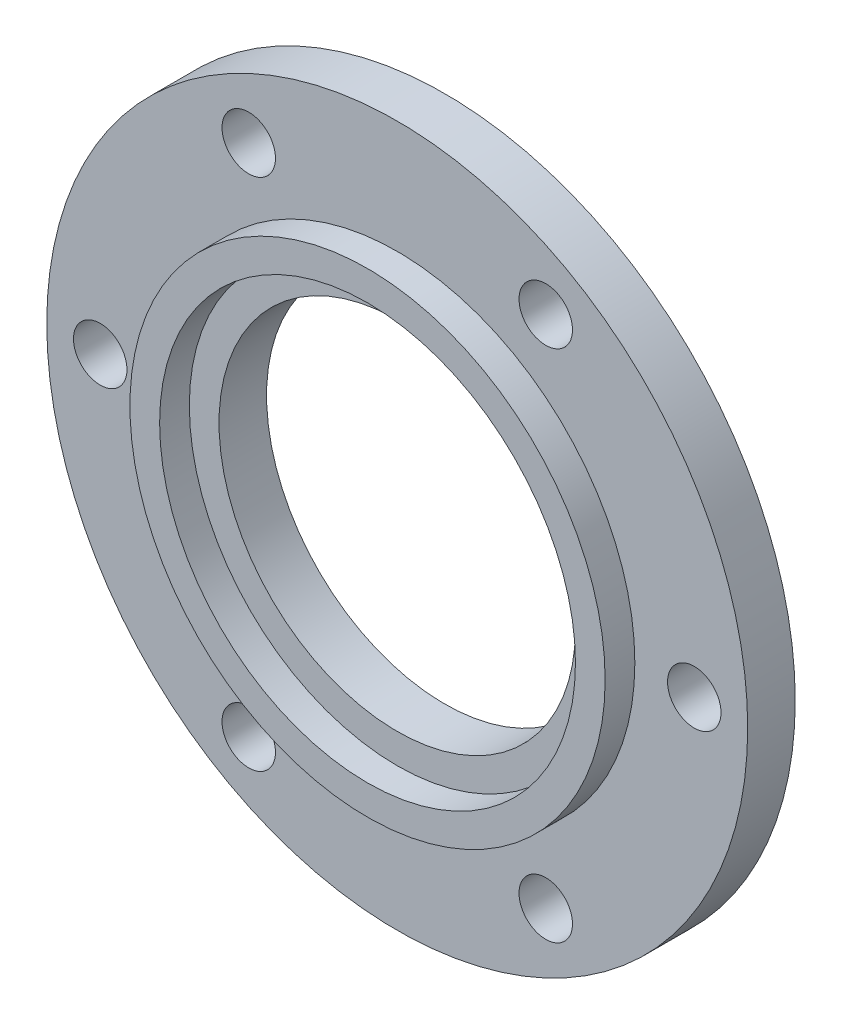
ISO-10303-21;
HEADER;
FILE_DESCRIPTION(('STEP AP214'),'2;1');
FILE_NAME('part.step','',(''),(''),'','','');
FILE_SCHEMA(('AUTOMOTIVE_DESIGN { 1 0 10303 214 1 1 1 1 }'));
ENDSEC;
DATA;
#1=APPLICATION_CONTEXT('core data for automotive mechanical design processes');
#2=APPLICATION_PROTOCOL_DEFINITION('international standard','automotive_design',2000,#1);
#3=PRODUCT_CONTEXT('',#1,'mechanical');
#4=PRODUCT('Part','Part','',(#3));
#5=PRODUCT_RELATED_PRODUCT_CATEGORY('part','',(#4));
#6=PRODUCT_DEFINITION_FORMATION('','',#4);
#7=PRODUCT_DEFINITION_CONTEXT('part definition',#1,'design');
#8=PRODUCT_DEFINITION('design','',#6,#7);
#9=PRODUCT_DEFINITION_SHAPE('','',#8);
#10=(LENGTH_UNIT() NAMED_UNIT(*) SI_UNIT(.MILLI.,.METRE.));
#11=(NAMED_UNIT(*) PLANE_ANGLE_UNIT() SI_UNIT($,.RADIAN.));
#12=(NAMED_UNIT(*) SI_UNIT($,.STERADIAN.) SOLID_ANGLE_UNIT());
#13=UNCERTAINTY_MEASURE_WITH_UNIT(LENGTH_MEASURE(1.E-05),#10,'distance_accuracy_value','');
#14=(GEOMETRIC_REPRESENTATION_CONTEXT(3) GLOBAL_UNCERTAINTY_ASSIGNED_CONTEXT((#13)) GLOBAL_UNIT_ASSIGNED_CONTEXT((#10,
#11,#12)) REPRESENTATION_CONTEXT('',''));
#15=CARTESIAN_POINT('',(0.,0.,0.));
#16=DIRECTION('',(0.,0.,1.));
#17=DIRECTION('',(1.,0.,0.));
#18=AXIS2_PLACEMENT_3D('',#15,#16,#17);
#19=CARTESIAN_POINT('',(0.,0.,8.));
#20=DIRECTION('',(0.,0.,1.));
#21=DIRECTION('',(1.,0.,0.));
#22=AXIS2_PLACEMENT_3D('',#19,#20,#21);
#23=PLANE('',#22);
#24=CARTESIAN_POINT('',(0.,0.,8.));
#25=DIRECTION('',(0.,0.,1.));
#26=DIRECTION('',(1.,0.,0.));
#27=AXIS2_PLACEMENT_3D('',#24,#25,#26);
#28=CIRCLE('',#27,30.);
#29=CARTESIAN_POINT('',(30.,0.,8.));
#30=VERTEX_POINT('',#29);
#31=EDGE_CURVE('E55',#30,#30,#28,.T.);
#32=ORIENTED_EDGE('',*,*,#31,.F.);
#33=EDGE_LOOP('',(#32));
#34=FACE_BOUND('',#33,.T.);
#35=CARTESIAN_POINT('',(0.,0.,8.));
#36=DIRECTION('',(0.,0.,1.));
#37=DIRECTION('',(1.,0.,0.));
#38=AXIS2_PLACEMENT_3D('',#35,#36,#37);
#39=CIRCLE('',#38,35.);
#40=CARTESIAN_POINT('',(35.,0.,8.));
#41=VERTEX_POINT('',#40);
#42=EDGE_CURVE('E10',#41,#41,#39,.F.);
#43=ORIENTED_EDGE('',*,*,#42,.F.);
#44=EDGE_LOOP('',(#43));
#45=FACE_BOUND('',#44,.T.);
#46=ADVANCED_FACE('F39',(#34,#45),#23,.T.);
#47=CARTESIAN_POINT('',(-24.9999999999995,43.3012701892222,8.));
#48=DIRECTION('',(0.,0.,1.));
#49=DIRECTION('',(1.,0.,0.));
#50=AXIS2_PLACEMENT_3D('',#47,#48,#49);
#51=CIRCLE('',#50,4.50000000000001);
#52=CARTESIAN_POINT('',(-20.4999999999995,43.3012701892222,8.));
#53=VERTEX_POINT('',#52);
#54=EDGE_CURVE('E71',#53,#53,#51,.F.);
#55=ORIENTED_EDGE('',*,*,#54,.T.);
#56=EDGE_LOOP('',(#55));
#57=FACE_BOUND('',#56,.T.);
#58=CARTESIAN_POINT('',(-50.,4.61436444609831E-13,8.));
#59=DIRECTION('',(0.,0.,1.));
#60=DIRECTION('',(1.,0.,0.));
#61=AXIS2_PLACEMENT_3D('',#58,#59,#60);
#62=CIRCLE('',#61,4.5);
#63=CARTESIAN_POINT('',(-45.5,4.61436444609831E-13,8.));
#64=VERTEX_POINT('',#63);
#65=EDGE_CURVE('E74',#64,#64,#62,.F.);
#66=ORIENTED_EDGE('',*,*,#65,.T.);
#67=EDGE_LOOP('',(#66));
#68=FACE_BOUND('',#67,.T.);
#69=CARTESIAN_POINT('',(-25.0000000000003,-43.3012701892218,8.));
#70=DIRECTION('',(0.,0.,1.));
#71=DIRECTION('',(1.,0.,0.));
#72=AXIS2_PLACEMENT_3D('',#69,#70,#71);
#73=CIRCLE('',#72,4.5);
#74=CARTESIAN_POINT('',(-20.5000000000003,-43.3012701892218,8.));
#75=VERTEX_POINT('',#74);
#76=EDGE_CURVE('E77',#75,#75,#73,.F.);
#77=ORIENTED_EDGE('',*,*,#76,.T.);
#78=EDGE_LOOP('',(#77));
#79=FACE_BOUND('',#78,.T.);
#80=CARTESIAN_POINT('',(24.9999999999998,-43.3012701892221,8.));
#81=DIRECTION('',(0.,0.,1.));
#82=DIRECTION('',(1.,0.,0.));
#83=AXIS2_PLACEMENT_3D('',#80,#81,#82);
#84=CIRCLE('',#83,4.50000000000001);
#85=CARTESIAN_POINT('',(29.4999999999998,-43.3012701892221,8.));
#86=VERTEX_POINT('',#85);
#87=EDGE_CURVE('E80',#86,#86,#84,.F.);
#88=ORIENTED_EDGE('',*,*,#87,.T.);
#89=EDGE_LOOP('',(#88));
#90=FACE_BOUND('',#89,.T.);
#91=CARTESIAN_POINT('',(50.,-1.21430643318376E-13,8.));
#92=DIRECTION('',(0.,0.,1.));
#93=DIRECTION('',(1.,0.,0.));
#94=AXIS2_PLACEMENT_3D('',#91,#92,#93);
#95=CIRCLE('',#94,4.50000000000001);
#96=CARTESIAN_POINT('',(54.5,-1.21430643318376E-13,8.));
#97=VERTEX_POINT('',#96);
#98=EDGE_CURVE('E83',#97,#97,#95,.F.);
#99=ORIENTED_EDGE('',*,*,#98,.T.);
#100=EDGE_LOOP('',(#99));
#101=FACE_BOUND('',#100,.T.);
#102=CARTESIAN_POINT('',(25.,43.3012701892219,8.));
#103=DIRECTION('',(0.,0.,1.));
#104=DIRECTION('',(1.,0.,0.));
#105=AXIS2_PLACEMENT_3D('',#102,#103,#104);
#106=CIRCLE('',#105,4.5);
#107=CARTESIAN_POINT('',(29.5,43.3012701892219,8.));
#108=VERTEX_POINT('',#107);
#109=EDGE_CURVE('E86',#108,#108,#106,.F.);
#110=ORIENTED_EDGE('',*,*,#109,.T.);
#111=EDGE_LOOP('',(#110));
#112=FACE_BOUND('',#111,.T.);
#113=CARTESIAN_POINT('',(0.,0.,8.));
#114=DIRECTION('',(0.,0.,1.));
#115=DIRECTION('',(1.,0.,0.));
#116=AXIS2_PLACEMENT_3D('',#113,#114,#115);
#117=CIRCLE('',#116,40.);
#118=CARTESIAN_POINT('',(40.,0.,8.));
#119=VERTEX_POINT('',#118);
#120=EDGE_CURVE('E63',#119,#119,#117,.T.);
#121=ORIENTED_EDGE('',*,*,#120,.F.);
#122=EDGE_LOOP('',(#121));
#123=FACE_BOUND('',#122,.T.);
#124=CARTESIAN_POINT('',(0.,0.,8.));
#125=DIRECTION('',(0.,0.,1.));
#126=DIRECTION('',(1.,0.,0.));
#127=AXIS2_PLACEMENT_3D('',#124,#125,#126);
#128=CIRCLE('',#127,59.);
#129=CARTESIAN_POINT('',(59.,0.,8.));
#130=VERTEX_POINT('',#129);
#131=EDGE_CURVE('E46',#130,#130,#128,.T.);
#132=ORIENTED_EDGE('',*,*,#131,.T.);
#133=EDGE_LOOP('',(#132));
#134=FACE_BOUND('',#133,.T.);
#135=ADVANCED_FACE('F113',(#57,#68,#79,#90,#101,#112,#123,#134),#23,.T.);
#136=CARTESIAN_POINT('',(0.,0.,0.));
#137=DIRECTION('',(0.,0.,1.));
#138=DIRECTION('',(1.,0.,0.));
#139=AXIS2_PLACEMENT_3D('',#136,#137,#138);
#140=PLANE('',#139);
#141=CARTESIAN_POINT('',(-24.9999999999995,43.3012701892222,0.));
#142=DIRECTION('',(0.,0.,1.));
#143=DIRECTION('',(1.,0.,0.));
#144=AXIS2_PLACEMENT_3D('',#141,#142,#143);
#145=CIRCLE('',#144,4.50000000000001);
#146=CARTESIAN_POINT('',(-20.4999999999995,43.3012701892222,0.));
#147=VERTEX_POINT('',#146);
#148=EDGE_CURVE('E93',#147,#147,#145,.F.);
#149=ORIENTED_EDGE('',*,*,#148,.F.);
#150=EDGE_LOOP('',(#149));
#151=FACE_BOUND('',#150,.T.);
#152=CARTESIAN_POINT('',(-50.,4.61436444609831E-13,0.));
#153=DIRECTION('',(0.,0.,1.));
#154=DIRECTION('',(1.,0.,0.));
#155=AXIS2_PLACEMENT_3D('',#152,#153,#154);
#156=CIRCLE('',#155,4.5);
#157=CARTESIAN_POINT('',(-45.5,4.61436444609831E-13,0.));
#158=VERTEX_POINT('',#157);
#159=EDGE_CURVE('E96',#158,#158,#156,.F.);
#160=ORIENTED_EDGE('',*,*,#159,.F.);
#161=EDGE_LOOP('',(#160));
#162=FACE_BOUND('',#161,.T.);
#163=CARTESIAN_POINT('',(-25.0000000000003,-43.3012701892218,0.));
#164=DIRECTION('',(0.,0.,1.));
#165=DIRECTION('',(1.,0.,0.));
#166=AXIS2_PLACEMENT_3D('',#163,#164,#165);
#167=CIRCLE('',#166,4.5);
#168=CARTESIAN_POINT('',(-20.5000000000003,-43.3012701892218,0.));
#169=VERTEX_POINT('',#168);
#170=EDGE_CURVE('E99',#169,#169,#167,.F.);
#171=ORIENTED_EDGE('',*,*,#170,.F.);
#172=EDGE_LOOP('',(#171));
#173=FACE_BOUND('',#172,.T.);
#174=CARTESIAN_POINT('',(24.9999999999998,-43.3012701892221,0.));
#175=DIRECTION('',(0.,0.,1.));
#176=DIRECTION('',(1.,0.,0.));
#177=AXIS2_PLACEMENT_3D('',#174,#175,#176);
#178=CIRCLE('',#177,4.50000000000001);
#179=CARTESIAN_POINT('',(29.4999999999998,-43.3012701892221,0.));
#180=VERTEX_POINT('',#179);
#181=EDGE_CURVE('E102',#180,#180,#178,.F.);
#182=ORIENTED_EDGE('',*,*,#181,.F.);
#183=EDGE_LOOP('',(#182));
#184=FACE_BOUND('',#183,.T.);
#185=CARTESIAN_POINT('',(50.,-1.21430643318376E-13,0.));
#186=DIRECTION('',(0.,0.,1.));
#187=DIRECTION('',(1.,0.,0.));
#188=AXIS2_PLACEMENT_3D('',#185,#186,#187);
#189=CIRCLE('',#188,4.50000000000001);
#190=CARTESIAN_POINT('',(54.5,-1.21430643318376E-13,0.));
#191=VERTEX_POINT('',#190);
#192=EDGE_CURVE('E92',#191,#191,#189,.F.);
#193=ORIENTED_EDGE('',*,*,#192,.F.);
#194=EDGE_LOOP('',(#193));
#195=FACE_BOUND('',#194,.T.);
#196=CARTESIAN_POINT('',(25.,43.3012701892219,0.));
#197=DIRECTION('',(0.,0.,1.));
#198=DIRECTION('',(1.,0.,0.));
#199=AXIS2_PLACEMENT_3D('',#196,#197,#198);
#200=CIRCLE('',#199,4.5);
#201=CARTESIAN_POINT('',(29.5,43.3012701892219,0.));
#202=VERTEX_POINT('',#201);
#203=EDGE_CURVE('E89',#202,#202,#200,.F.);
#204=ORIENTED_EDGE('',*,*,#203,.F.);
#205=EDGE_LOOP('',(#204));
#206=FACE_BOUND('',#205,.T.);
#207=CARTESIAN_POINT('',(0.,0.,0.));
#208=DIRECTION('',(0.,0.,1.));
#209=DIRECTION('',(1.,0.,0.));
#210=AXIS2_PLACEMENT_3D('',#207,#208,#209);
#211=CIRCLE('',#210,59.);
#212=CARTESIAN_POINT('',(59.,0.,0.));
#213=VERTEX_POINT('',#212);
#214=EDGE_CURVE('E50',#213,#213,#211,.T.);
#215=ORIENTED_EDGE('',*,*,#214,.F.);
#216=EDGE_LOOP('',(#215));
#217=FACE_BOUND('',#216,.T.);
#218=CARTESIAN_POINT('',(0.,0.,0.));
#219=DIRECTION('',(0.,0.,1.));
#220=DIRECTION('',(1.,0.,0.));
#221=AXIS2_PLACEMENT_3D('',#218,#219,#220);
#222=CIRCLE('',#221,30.);
#223=CARTESIAN_POINT('',(30.,0.,0.));
#224=VERTEX_POINT('',#223);
#225=EDGE_CURVE('E57',#224,#224,#222,.T.);
#226=ORIENTED_EDGE('',*,*,#225,.T.);
#227=EDGE_LOOP('',(#226));
#228=FACE_BOUND('',#227,.T.);
#229=ADVANCED_FACE('F110',(#151,#162,#173,#184,#195,#206,#217,#228),#140,.F.);
#230=CARTESIAN_POINT('',(0.,0.,8.));
#231=DIRECTION('',(0.,0.,-1.));
#232=DIRECTION('',(-1.,0.,0.));
#233=AXIS2_PLACEMENT_3D('',#230,#231,#232);
#234=CYLINDRICAL_SURFACE('',#233,59.);
#235=ORIENTED_EDGE('',*,*,#131,.F.);
#236=EDGE_LOOP('',(#235));
#237=FACE_BOUND('',#236,.T.);
#238=ORIENTED_EDGE('',*,*,#214,.T.);
#239=EDGE_LOOP('',(#238));
#240=FACE_BOUND('',#239,.T.);
#241=ADVANCED_FACE('F41',(#237,#240),#234,.T.);
#242=CARTESIAN_POINT('',(0.,0.,8.));
#243=DIRECTION('',(0.,0.,-1.));
#244=DIRECTION('',(-1.,0.,0.));
#245=AXIS2_PLACEMENT_3D('',#242,#243,#244);
#246=CYLINDRICAL_SURFACE('',#245,30.);
#247=ORIENTED_EDGE('',*,*,#31,.T.);
#248=EDGE_LOOP('',(#247));
#249=FACE_BOUND('',#248,.T.);
#250=ORIENTED_EDGE('',*,*,#225,.F.);
#251=EDGE_LOOP('',(#250));
#252=FACE_BOUND('',#251,.T.);
#253=ADVANCED_FACE('F121',(#249,#252),#246,.F.);
#254=CARTESIAN_POINT('',(0.,0.,13.));
#255=DIRECTION('',(0.,0.,1.));
#256=DIRECTION('',(1.,0.,0.));
#257=AXIS2_PLACEMENT_3D('',#254,#255,#256);
#258=PLANE('',#257);
#259=CARTESIAN_POINT('',(0.,0.,13.));
#260=DIRECTION('',(0.,0.,1.));
#261=DIRECTION('',(1.,0.,0.));
#262=AXIS2_PLACEMENT_3D('',#259,#260,#261);
#263=CIRCLE('',#262,40.);
#264=CARTESIAN_POINT('',(40.,0.,13.));
#265=VERTEX_POINT('',#264);
#266=EDGE_CURVE('E60',#265,#265,#263,.T.);
#267=ORIENTED_EDGE('',*,*,#266,.T.);
#268=EDGE_LOOP('',(#267));
#269=FACE_BOUND('',#268,.T.);
#270=CARTESIAN_POINT('',(0.,0.,13.));
#271=DIRECTION('',(0.,0.,1.));
#272=DIRECTION('',(1.,0.,0.));
#273=AXIS2_PLACEMENT_3D('',#270,#271,#272);
#274=CIRCLE('',#273,35.);
#275=CARTESIAN_POINT('',(35.,0.,13.));
#276=VERTEX_POINT('',#275);
#277=EDGE_CURVE('E66',#276,#276,#274,.T.);
#278=ORIENTED_EDGE('',*,*,#277,.F.);
#279=EDGE_LOOP('',(#278));
#280=FACE_BOUND('',#279,.T.);
#281=ADVANCED_FACE('F123',(#269,#280),#258,.T.);
#282=CARTESIAN_POINT('',(0.,0.,13.));
#283=DIRECTION('',(0.,0.,-1.));
#284=DIRECTION('',(-1.,0.,0.));
#285=AXIS2_PLACEMENT_3D('',#282,#283,#284);
#286=CYLINDRICAL_SURFACE('',#285,40.);
#287=ORIENTED_EDGE('',*,*,#266,.F.);
#288=EDGE_LOOP('',(#287));
#289=FACE_BOUND('',#288,.T.);
#290=ORIENTED_EDGE('',*,*,#120,.T.);
#291=EDGE_LOOP('',(#290));
#292=FACE_BOUND('',#291,.T.);
#293=ADVANCED_FACE('F131',(#289,#292),#286,.T.);
#294=CARTESIAN_POINT('',(0.,0.,13.));
#295=DIRECTION('',(0.,0.,-1.));
#296=DIRECTION('',(-1.,0.,0.));
#297=AXIS2_PLACEMENT_3D('',#294,#295,#296);
#298=CYLINDRICAL_SURFACE('',#297,35.);
#299=ORIENTED_EDGE('',*,*,#277,.T.);
#300=EDGE_LOOP('',(#299));
#301=FACE_BOUND('',#300,.T.);
#302=ORIENTED_EDGE('',*,*,#42,.T.);
#303=EDGE_LOOP('',(#302));
#304=FACE_BOUND('',#303,.T.);
#305=ADVANCED_FACE('F162',(#301,#304),#298,.F.);
#306=CARTESIAN_POINT('',(25.,43.3012701892219,13.));
#307=DIRECTION('',(0.,0.,-1.));
#308=DIRECTION('',(-1.,0.,0.));
#309=AXIS2_PLACEMENT_3D('',#306,#307,#308);
#310=CYLINDRICAL_SURFACE('',#309,4.5);
#311=ORIENTED_EDGE('',*,*,#109,.F.);
#312=EDGE_LOOP('',(#311));
#313=FACE_BOUND('',#312,.T.);
#314=ORIENTED_EDGE('',*,*,#203,.T.);
#315=EDGE_LOOP('',(#314));
#316=FACE_BOUND('',#315,.T.);
#317=ADVANCED_FACE('F166',(#313,#316),#310,.F.);
#318=CARTESIAN_POINT('',(50.,-1.21430643318376E-13,13.));
#319=DIRECTION('',(0.,0.,-1.));
#320=DIRECTION('',(-1.,0.,0.));
#321=AXIS2_PLACEMENT_3D('',#318,#319,#320);
#322=CYLINDRICAL_SURFACE('',#321,4.50000000000001);
#323=ORIENTED_EDGE('',*,*,#98,.F.);
#324=EDGE_LOOP('',(#323));
#325=FACE_BOUND('',#324,.T.);
#326=ORIENTED_EDGE('',*,*,#192,.T.);
#327=EDGE_LOOP('',(#326));
#328=FACE_BOUND('',#327,.T.);
#329=ADVANCED_FACE('F108',(#325,#328),#322,.F.);
#330=CARTESIAN_POINT('',(24.9999999999998,-43.3012701892221,13.));
#331=DIRECTION('',(0.,0.,-1.));
#332=DIRECTION('',(-1.,0.,0.));
#333=AXIS2_PLACEMENT_3D('',#330,#331,#332);
#334=CYLINDRICAL_SURFACE('',#333,4.50000000000001);
#335=ORIENTED_EDGE('',*,*,#87,.F.);
#336=EDGE_LOOP('',(#335));
#337=FACE_BOUND('',#336,.T.);
#338=ORIENTED_EDGE('',*,*,#181,.T.);
#339=EDGE_LOOP('',(#338));
#340=FACE_BOUND('',#339,.T.);
#341=ADVANCED_FACE('F185',(#337,#340),#334,.F.);
#342=CARTESIAN_POINT('',(-25.0000000000003,-43.3012701892218,13.));
#343=DIRECTION('',(0.,0.,-1.));
#344=DIRECTION('',(-1.,0.,0.));
#345=AXIS2_PLACEMENT_3D('',#342,#343,#344);
#346=CYLINDRICAL_SURFACE('',#345,4.5);
#347=ORIENTED_EDGE('',*,*,#76,.F.);
#348=EDGE_LOOP('',(#347));
#349=FACE_BOUND('',#348,.T.);
#350=ORIENTED_EDGE('',*,*,#170,.T.);
#351=EDGE_LOOP('',(#350));
#352=FACE_BOUND('',#351,.T.);
#353=ADVANCED_FACE('F181',(#349,#352),#346,.F.);
#354=CARTESIAN_POINT('',(-50.,4.61436444609831E-13,13.));
#355=DIRECTION('',(0.,0.,-1.));
#356=DIRECTION('',(-1.,0.,0.));
#357=AXIS2_PLACEMENT_3D('',#354,#355,#356);
#358=CYLINDRICAL_SURFACE('',#357,4.5);
#359=ORIENTED_EDGE('',*,*,#65,.F.);
#360=EDGE_LOOP('',(#359));
#361=FACE_BOUND('',#360,.T.);
#362=ORIENTED_EDGE('',*,*,#159,.T.);
#363=EDGE_LOOP('',(#362));
#364=FACE_BOUND('',#363,.T.);
#365=ADVANCED_FACE('F177',(#361,#364),#358,.F.);
#366=CARTESIAN_POINT('',(-24.9999999999995,43.3012701892222,13.));
#367=DIRECTION('',(0.,0.,-1.));
#368=DIRECTION('',(-1.,0.,0.));
#369=AXIS2_PLACEMENT_3D('',#366,#367,#368);
#370=CYLINDRICAL_SURFACE('',#369,4.50000000000001);
#371=ORIENTED_EDGE('',*,*,#54,.F.);
#372=EDGE_LOOP('',(#371));
#373=FACE_BOUND('',#372,.T.);
#374=ORIENTED_EDGE('',*,*,#148,.T.);
#375=EDGE_LOOP('',(#374));
#376=FACE_BOUND('',#375,.T.);
#377=ADVANCED_FACE('F174',(#373,#376),#370,.F.);
#378=CLOSED_SHELL('',(#46,#135,#229,#241,#253,#281,#293,#305,#317,#329,#341,#353,#365,#377));
#379=MANIFOLD_SOLID_BREP('B2',#378);
#380=ADVANCED_BREP_SHAPE_REPRESENTATION('',(#18,#379),#14);
#381=SHAPE_DEFINITION_REPRESENTATION(#9,#380);
ENDSEC;
END-ISO-10303-21;
